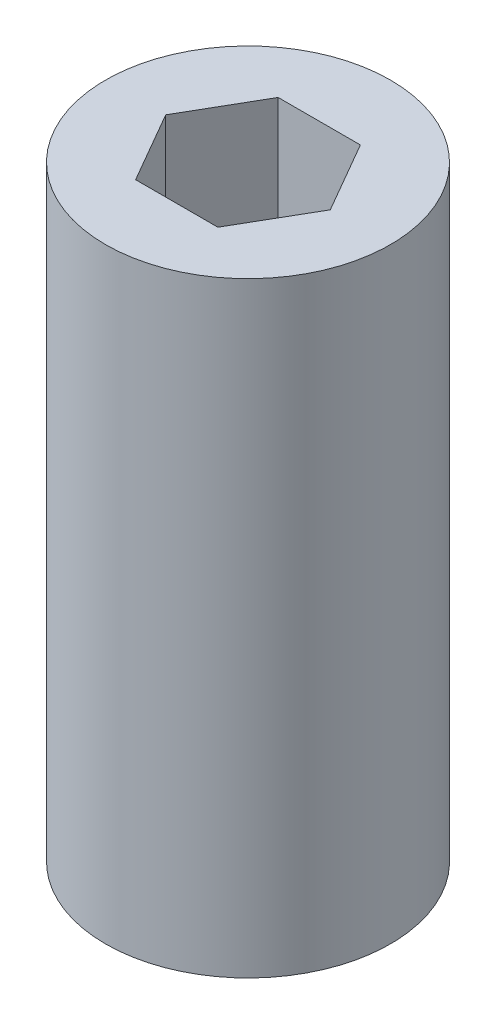
ISO-10303-21;
HEADER;
FILE_DESCRIPTION(('STEP AP214'),'2;1');
FILE_NAME('part.step','',(''),(''),'','','');
FILE_SCHEMA(('AUTOMOTIVE_DESIGN { 1 0 10303 214 1 1 1 1 }'));
ENDSEC;
DATA;
#1=APPLICATION_CONTEXT('core data for automotive mechanical design processes');
#2=APPLICATION_PROTOCOL_DEFINITION('international standard','automotive_design',2000,#1);
#3=PRODUCT_CONTEXT('',#1,'mechanical');
#4=PRODUCT('Part','Part','',(#3));
#5=PRODUCT_RELATED_PRODUCT_CATEGORY('part','',(#4));
#6=PRODUCT_DEFINITION_FORMATION('','',#4);
#7=PRODUCT_DEFINITION_CONTEXT('part definition',#1,'design');
#8=PRODUCT_DEFINITION('design','',#6,#7);
#9=PRODUCT_DEFINITION_SHAPE('','',#8);
#10=(LENGTH_UNIT() NAMED_UNIT(*) SI_UNIT(.MILLI.,.METRE.));
#11=(NAMED_UNIT(*) PLANE_ANGLE_UNIT() SI_UNIT($,.RADIAN.));
#12=(NAMED_UNIT(*) SI_UNIT($,.STERADIAN.) SOLID_ANGLE_UNIT());
#13=UNCERTAINTY_MEASURE_WITH_UNIT(LENGTH_MEASURE(1.E-05),#10,'distance_accuracy_value','');
#14=(GEOMETRIC_REPRESENTATION_CONTEXT(3) GLOBAL_UNCERTAINTY_ASSIGNED_CONTEXT((#13)) GLOBAL_UNIT_ASSIGNED_CONTEXT((#10,
#11,#12)) REPRESENTATION_CONTEXT('',''));
#15=CARTESIAN_POINT('',(0.,0.,0.));
#16=DIRECTION('',(0.,0.,1.));
#17=DIRECTION('',(1.,0.,0.));
#18=AXIS2_PLACEMENT_3D('',#15,#16,#17);
#19=CARTESIAN_POINT('',(0.,53.975,0.));
#20=DIRECTION('',(0.,1.,0.));
#21=DIRECTION('',(0.,0.,1.));
#22=AXIS2_PLACEMENT_3D('',#19,#20,#21);
#23=PLANE('',#22);
#24=CARTESIAN_POINT('',(0.,53.975,0.));
#25=DIRECTION('',(0.,1.,0.));
#26=DIRECTION('',(0.,0.,1.));
#27=AXIS2_PLACEMENT_3D('',#24,#25,#26);
#28=CIRCLE('',#27,12.7);
#29=CARTESIAN_POINT('',(0.,53.975,12.7));
#30=VERTEX_POINT('',#29);
#31=EDGE_CURVE('E11',#30,#30,#28,.T.);
#32=ORIENTED_EDGE('',*,*,#31,.T.);
#33=EDGE_LOOP('',(#32));
#34=FACE_BOUND('',#33,.T.);
#35=DIRECTION('',(0.5,0.,-0.866025403784439));
#36=VECTOR('',#35,1.);
#37=CARTESIAN_POINT('',(3.66617420935412,53.975,6.35));
#38=LINE('',#37,#36);
#39=CARTESIAN_POINT('',(3.66617420935412,53.975,6.35));
#40=VERTEX_POINT('',#39);
#41=CARTESIAN_POINT('',(7.33234841870825,53.975,0.));
#42=VERTEX_POINT('',#41);
#43=EDGE_CURVE('E98',#40,#42,#38,.T.);
#44=ORIENTED_EDGE('',*,*,#43,.F.);
#45=DIRECTION('',(1.,0.,0.));
#46=VECTOR('',#45,1.);
#47=CARTESIAN_POINT('',(-3.66617420935413,53.975,6.35));
#48=LINE('',#47,#46);
#49=CARTESIAN_POINT('',(-3.66617420935413,53.975,6.35));
#50=VERTEX_POINT('',#49);
#51=EDGE_CURVE('E90',#50,#40,#48,.T.);
#52=ORIENTED_EDGE('',*,*,#51,.F.);
#53=DIRECTION('',(0.5,0.,0.866025403784439));
#54=VECTOR('',#53,1.);
#55=CARTESIAN_POINT('',(-7.33234841870826,53.975,0.));
#56=LINE('',#55,#54);
#57=CARTESIAN_POINT('',(-7.33234841870826,53.975,0.));
#58=VERTEX_POINT('',#57);
#59=EDGE_CURVE('E118',#58,#50,#56,.T.);
#60=ORIENTED_EDGE('',*,*,#59,.F.);
#61=DIRECTION('',(-0.5,0.,0.866025403784439));
#62=VECTOR('',#61,1.);
#63=CARTESIAN_POINT('',(-3.66617420935413,53.975,-6.35));
#64=LINE('',#63,#62);
#65=CARTESIAN_POINT('',(-3.66617420935413,53.975,-6.35));
#66=VERTEX_POINT('',#65);
#67=EDGE_CURVE('E116',#66,#58,#64,.T.);
#68=ORIENTED_EDGE('',*,*,#67,.F.);
#69=DIRECTION('',(-1.,0.,0.));
#70=VECTOR('',#69,1.);
#71=CARTESIAN_POINT('',(3.66617420935412,53.975,-6.35));
#72=LINE('',#71,#70);
#73=CARTESIAN_POINT('',(3.66617420935412,53.975,-6.35));
#74=VERTEX_POINT('',#73);
#75=EDGE_CURVE('E112',#74,#66,#72,.T.);
#76=ORIENTED_EDGE('',*,*,#75,.F.);
#77=DIRECTION('',(-0.5,0.,-0.866025403784438));
#78=VECTOR('',#77,1.);
#79=CARTESIAN_POINT('',(7.33234841870825,53.975,0.));
#80=LINE('',#79,#78);
#81=EDGE_CURVE('E110',#42,#74,#80,.T.);
#82=ORIENTED_EDGE('',*,*,#81,.F.);
#83=EDGE_LOOP('',(#44,#52,#60,#68,#76,#82));
#84=FACE_BOUND('',#83,.T.);
#85=ADVANCED_FACE('F37',(#34,#84),#23,.T.);
#86=CARTESIAN_POINT('',(0.,0.,0.));
#87=DIRECTION('',(0.,1.,0.));
#88=DIRECTION('',(0.,0.,1.));
#89=AXIS2_PLACEMENT_3D('',#86,#87,#88);
#90=PLANE('',#89);
#91=CARTESIAN_POINT('',(0.,0.,0.));
#92=DIRECTION('',(0.,1.,0.));
#93=DIRECTION('',(0.,0.,1.));
#94=AXIS2_PLACEMENT_3D('',#91,#92,#93);
#95=CIRCLE('',#94,12.7);
#96=CARTESIAN_POINT('',(0.,0.,12.7));
#97=VERTEX_POINT('',#96);
#98=EDGE_CURVE('E41',#97,#97,#95,.T.);
#99=ORIENTED_EDGE('',*,*,#98,.F.);
#100=EDGE_LOOP('',(#99));
#101=FACE_BOUND('',#100,.T.);
#102=DIRECTION('',(1.,0.,0.));
#103=VECTOR('',#102,1.);
#104=CARTESIAN_POINT('',(-3.66617420935413,0.,6.35));
#105=LINE('',#104,#103);
#106=CARTESIAN_POINT('',(-3.66617420935413,0.,6.35));
#107=VERTEX_POINT('',#106);
#108=CARTESIAN_POINT('',(3.66617420935412,0.,6.35));
#109=VERTEX_POINT('',#108);
#110=EDGE_CURVE('E60',#107,#109,#105,.T.);
#111=ORIENTED_EDGE('',*,*,#110,.T.);
#112=DIRECTION('',(0.5,0.,-0.866025403784439));
#113=VECTOR('',#112,1.);
#114=CARTESIAN_POINT('',(3.66617420935412,0.,6.35));
#115=LINE('',#114,#113);
#116=CARTESIAN_POINT('',(7.33234841870825,0.,0.));
#117=VERTEX_POINT('',#116);
#118=EDGE_CURVE('E105',#109,#117,#115,.T.);
#119=ORIENTED_EDGE('',*,*,#118,.T.);
#120=DIRECTION('',(-0.5,0.,-0.866025403784438));
#121=VECTOR('',#120,1.);
#122=CARTESIAN_POINT('',(7.33234841870825,0.,0.));
#123=LINE('',#122,#121);
#124=CARTESIAN_POINT('',(3.66617420935412,0.,-6.35));
#125=VERTEX_POINT('',#124);
#126=EDGE_CURVE('E122',#117,#125,#123,.T.);
#127=ORIENTED_EDGE('',*,*,#126,.T.);
#128=DIRECTION('',(-1.,0.,0.));
#129=VECTOR('',#128,1.);
#130=CARTESIAN_POINT('',(3.66617420935412,0.,-6.35));
#131=LINE('',#130,#129);
#132=CARTESIAN_POINT('',(-3.66617420935413,0.,-6.35));
#133=VERTEX_POINT('',#132);
#134=EDGE_CURVE('E125',#125,#133,#131,.T.);
#135=ORIENTED_EDGE('',*,*,#134,.T.);
#136=DIRECTION('',(-0.5,0.,0.866025403784439));
#137=VECTOR('',#136,1.);
#138=CARTESIAN_POINT('',(-3.66617420935413,0.,-6.35));
#139=LINE('',#138,#137);
#140=CARTESIAN_POINT('',(-7.33234841870826,0.,0.));
#141=VERTEX_POINT('',#140);
#142=EDGE_CURVE('E128',#133,#141,#139,.T.);
#143=ORIENTED_EDGE('',*,*,#142,.T.);
#144=DIRECTION('',(0.5,0.,0.866025403784439));
#145=VECTOR('',#144,1.);
#146=CARTESIAN_POINT('',(-7.33234841870826,0.,0.));
#147=LINE('',#146,#145);
#148=EDGE_CURVE('E99',#141,#107,#147,.T.);
#149=ORIENTED_EDGE('',*,*,#148,.T.);
#150=EDGE_LOOP('',(#111,#119,#127,#135,#143,#149));
#151=FACE_BOUND('',#150,.T.);
#152=ADVANCED_FACE('F145',(#101,#151),#90,.F.);
#153=CARTESIAN_POINT('',(0.,53.975,0.));
#154=DIRECTION('',(0.,-1.,0.));
#155=DIRECTION('',(0.,0.,-1.));
#156=AXIS2_PLACEMENT_3D('',#153,#154,#155);
#157=CYLINDRICAL_SURFACE('',#156,12.7);
#158=ORIENTED_EDGE('',*,*,#31,.F.);
#159=EDGE_LOOP('',(#158));
#160=FACE_BOUND('',#159,.T.);
#161=ORIENTED_EDGE('',*,*,#98,.T.);
#162=EDGE_LOOP('',(#161));
#163=FACE_BOUND('',#162,.T.);
#164=ADVANCED_FACE('F39',(#160,#163),#157,.T.);
#165=CARTESIAN_POINT('',(-3.66617420935413,53.975,6.35));
#166=DIRECTION('',(0.,0.,-1.));
#167=DIRECTION('',(-1.,0.,0.));
#168=AXIS2_PLACEMENT_3D('',#165,#166,#167);
#169=PLANE('',#168);
#170=ORIENTED_EDGE('',*,*,#110,.F.);
#171=DIRECTION('',(0.,-1.,0.));
#172=VECTOR('',#171,1.);
#173=CARTESIAN_POINT('',(-3.66617420935413,53.975,6.35));
#174=LINE('',#173,#172);
#175=EDGE_CURVE('E94',#50,#107,#174,.T.);
#176=ORIENTED_EDGE('',*,*,#175,.F.);
#177=ORIENTED_EDGE('',*,*,#51,.T.);
#178=DIRECTION('',(0.,-1.,0.));
#179=VECTOR('',#178,1.);
#180=CARTESIAN_POINT('',(3.66617420935412,53.975,6.35));
#181=LINE('',#180,#179);
#182=EDGE_CURVE('E93',#40,#109,#181,.T.);
#183=ORIENTED_EDGE('',*,*,#182,.T.);
#184=EDGE_LOOP('',(#170,#176,#177,#183));
#185=FACE_BOUND('',#184,.T.);
#186=ADVANCED_FACE('F92',(#185),#169,.T.);
#187=CARTESIAN_POINT('',(3.66617420935412,53.975,6.35));
#188=DIRECTION('',(-0.866025403784438,0.,-0.5));
#189=DIRECTION('',(-0.5,0.,0.866025403784439));
#190=AXIS2_PLACEMENT_3D('',#187,#188,#189);
#191=PLANE('',#190);
#192=ORIENTED_EDGE('',*,*,#118,.F.);
#193=ORIENTED_EDGE('',*,*,#182,.F.);
#194=ORIENTED_EDGE('',*,*,#43,.T.);
#195=DIRECTION('',(0.,-1.,0.));
#196=VECTOR('',#195,1.);
#197=CARTESIAN_POINT('',(7.33234841870825,53.975,0.));
#198=LINE('',#197,#196);
#199=EDGE_CURVE('E106',#42,#117,#198,.T.);
#200=ORIENTED_EDGE('',*,*,#199,.T.);
#201=EDGE_LOOP('',(#192,#193,#194,#200));
#202=FACE_BOUND('',#201,.T.);
#203=ADVANCED_FACE('F102',(#202),#191,.T.);
#204=CARTESIAN_POINT('',(7.33234841870825,53.975,0.));
#205=DIRECTION('',(-0.866025403784438,0.,0.5));
#206=DIRECTION('',(0.5,0.,0.866025403784438));
#207=AXIS2_PLACEMENT_3D('',#204,#205,#206);
#208=PLANE('',#207);
#209=ORIENTED_EDGE('',*,*,#126,.F.);
#210=ORIENTED_EDGE('',*,*,#199,.F.);
#211=ORIENTED_EDGE('',*,*,#81,.T.);
#212=DIRECTION('',(0.,-1.,0.));
#213=VECTOR('',#212,1.);
#214=CARTESIAN_POINT('',(3.66617420935412,53.975,-6.35));
#215=LINE('',#214,#213);
#216=EDGE_CURVE('E137',#74,#125,#215,.T.);
#217=ORIENTED_EDGE('',*,*,#216,.T.);
#218=EDGE_LOOP('',(#209,#210,#211,#217));
#219=FACE_BOUND('',#218,.T.);
#220=ADVANCED_FACE('F141',(#219),#208,.T.);
#221=CARTESIAN_POINT('',(3.66617420935412,53.975,-6.35));
#222=DIRECTION('',(0.,0.,1.));
#223=DIRECTION('',(1.,0.,0.));
#224=AXIS2_PLACEMENT_3D('',#221,#222,#223);
#225=PLANE('',#224);
#226=ORIENTED_EDGE('',*,*,#134,.F.);
#227=ORIENTED_EDGE('',*,*,#216,.F.);
#228=ORIENTED_EDGE('',*,*,#75,.T.);
#229=DIRECTION('',(0.,-1.,0.));
#230=VECTOR('',#229,1.);
#231=CARTESIAN_POINT('',(-3.66617420935413,53.975,-6.35));
#232=LINE('',#231,#230);
#233=EDGE_CURVE('E135',#66,#133,#232,.T.);
#234=ORIENTED_EDGE('',*,*,#233,.T.);
#235=EDGE_LOOP('',(#226,#227,#228,#234));
#236=FACE_BOUND('',#235,.T.);
#237=ADVANCED_FACE('F153',(#236),#225,.T.);
#238=CARTESIAN_POINT('',(-3.66617420935413,53.975,-6.35));
#239=DIRECTION('',(0.866025403784439,0.,0.5));
#240=DIRECTION('',(0.5,0.,-0.866025403784439));
#241=AXIS2_PLACEMENT_3D('',#238,#239,#240);
#242=PLANE('',#241);
#243=ORIENTED_EDGE('',*,*,#142,.F.);
#244=ORIENTED_EDGE('',*,*,#233,.F.);
#245=ORIENTED_EDGE('',*,*,#67,.T.);
#246=DIRECTION('',(0.,-1.,0.));
#247=VECTOR('',#246,1.);
#248=CARTESIAN_POINT('',(-7.33234841870826,53.975,0.));
#249=LINE('',#248,#247);
#250=EDGE_CURVE('E52',#58,#141,#249,.T.);
#251=ORIENTED_EDGE('',*,*,#250,.T.);
#252=EDGE_LOOP('',(#243,#244,#245,#251));
#253=FACE_BOUND('',#252,.T.);
#254=ADVANCED_FACE('F151',(#253),#242,.T.);
#255=CARTESIAN_POINT('',(-7.33234841870826,53.975,0.));
#256=DIRECTION('',(0.866025403784439,0.,-0.5));
#257=DIRECTION('',(-0.5,0.,-0.866025403784439));
#258=AXIS2_PLACEMENT_3D('',#255,#256,#257);
#259=PLANE('',#258);
#260=ORIENTED_EDGE('',*,*,#148,.F.);
#261=ORIENTED_EDGE('',*,*,#250,.F.);
#262=ORIENTED_EDGE('',*,*,#59,.T.);
#263=ORIENTED_EDGE('',*,*,#175,.T.);
#264=EDGE_LOOP('',(#260,#261,#262,#263));
#265=FACE_BOUND('',#264,.T.);
#266=ADVANCED_FACE('F147',(#265),#259,.T.);
#267=CLOSED_SHELL('',(#85,#152,#164,#186,#203,#220,#237,#254,#266));
#268=MANIFOLD_SOLID_BREP('B2',#267);
#269=ADVANCED_BREP_SHAPE_REPRESENTATION('',(#18,#268),#14);
#270=SHAPE_DEFINITION_REPRESENTATION(#9,#269);
ENDSEC;
END-ISO-10303-21;
